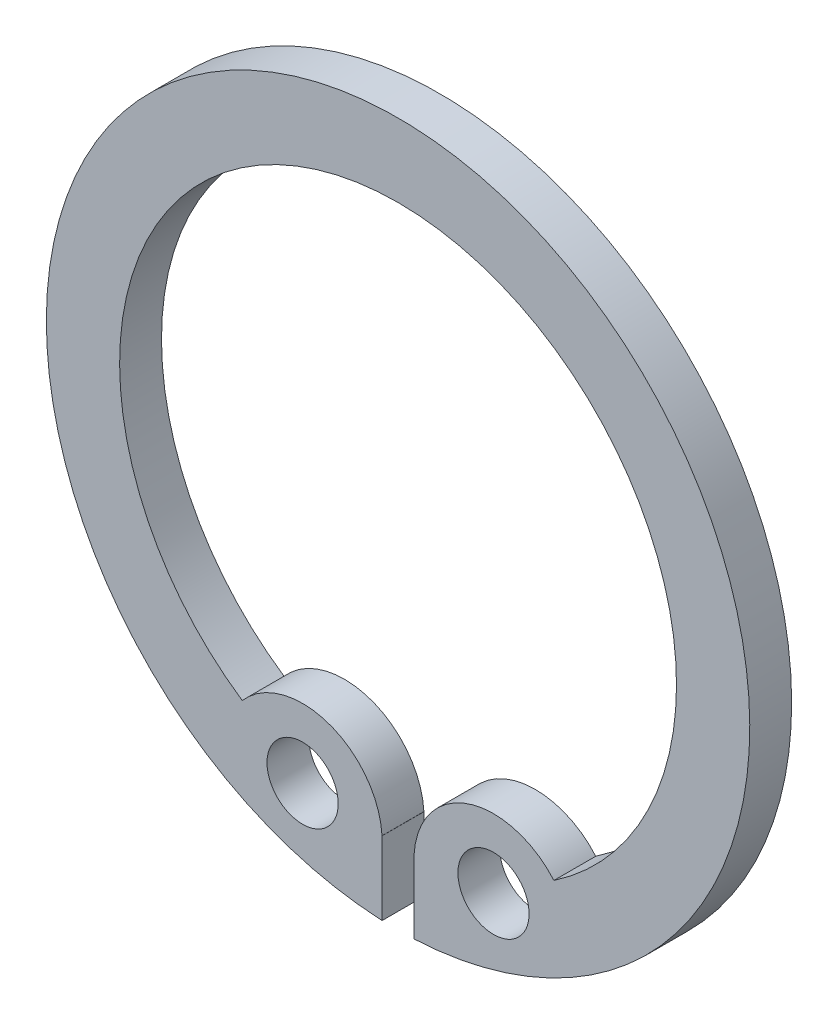
ISO-10303-21;
HEADER;
FILE_DESCRIPTION(('STEP AP214'),'2;1');
FILE_NAME('part.step','',(''),(''),'','','');
FILE_SCHEMA(('AUTOMOTIVE_DESIGN { 1 0 10303 214 1 1 1 1 }'));
ENDSEC;
DATA;
#1=APPLICATION_CONTEXT('core data for automotive mechanical design processes');
#2=APPLICATION_PROTOCOL_DEFINITION('international standard','automotive_design',2000,#1);
#3=PRODUCT_CONTEXT('',#1,'mechanical');
#4=PRODUCT('Part','Part','',(#3));
#5=PRODUCT_RELATED_PRODUCT_CATEGORY('part','',(#4));
#6=PRODUCT_DEFINITION_FORMATION('','',#4);
#7=PRODUCT_DEFINITION_CONTEXT('part definition',#1,'design');
#8=PRODUCT_DEFINITION('design','',#6,#7);
#9=PRODUCT_DEFINITION_SHAPE('','',#8);
#10=(LENGTH_UNIT() NAMED_UNIT(*) SI_UNIT(.MILLI.,.METRE.));
#11=(NAMED_UNIT(*) PLANE_ANGLE_UNIT() SI_UNIT($,.RADIAN.));
#12=(NAMED_UNIT(*) SI_UNIT($,.STERADIAN.) SOLID_ANGLE_UNIT());
#13=UNCERTAINTY_MEASURE_WITH_UNIT(LENGTH_MEASURE(1.E-05),#10,'distance_accuracy_value','');
#14=(GEOMETRIC_REPRESENTATION_CONTEXT(3) GLOBAL_UNCERTAINTY_ASSIGNED_CONTEXT((#13)) GLOBAL_UNIT_ASSIGNED_CONTEXT((#10,
#11,#12)) REPRESENTATION_CONTEXT('',''));
#15=CARTESIAN_POINT('',(0.,0.,0.));
#16=DIRECTION('',(0.,0.,1.));
#17=DIRECTION('',(1.,0.,0.));
#18=AXIS2_PLACEMENT_3D('',#15,#16,#17);
#19=CARTESIAN_POINT('',(0.,0.,1.));
#20=DIRECTION('',(0.,0.,1.));
#21=DIRECTION('',(1.,0.,0.));
#22=AXIS2_PLACEMENT_3D('',#19,#20,#21);
#23=PLANE('',#22);
#24=CARTESIAN_POINT('',(0.,0.,1.));
#25=DIRECTION('',(0.,0.,-1.));
#26=DIRECTION('',(1.,0.,0.));
#27=AXIS2_PLACEMENT_3D('',#24,#25,#26);
#28=CIRCLE('',#27,6.65);
#29=CARTESIAN_POINT('',(-3.7209215577053,-5.51155538495279,1.));
#30=VERTEX_POINT('',#29);
#31=CARTESIAN_POINT('',(3.7209215577057,-5.51155538495279,1.));
#32=VERTEX_POINT('',#31);
#33=EDGE_CURVE('E13',#30,#32,#28,.T.);
#34=ORIENTED_EDGE('',*,*,#33,.T.);
#35=CARTESIAN_POINT('',(2.28000000000017,-6.75,1.));
#36=DIRECTION('',(0.,0.,1.));
#37=DIRECTION('',(-1.,0.,0.));
#38=AXIS2_PLACEMENT_3D('',#35,#36,#37);
#39=CIRCLE('',#38,1.9);
#40=CARTESIAN_POINT('',(0.383248226518307,-6.63894726570943,1.));
#41=VERTEX_POINT('',#40);
#42=EDGE_CURVE('E139',#32,#41,#39,.T.);
#43=ORIENTED_EDGE('',*,*,#42,.T.);
#44=CARTESIAN_POINT('',(0.,0.,1.));
#45=DIRECTION('',(0.,0.,-1.));
#46=DIRECTION('',(1.,0.,0.));
#47=AXIS2_PLACEMENT_3D('',#44,#45,#46);
#48=CIRCLE('',#47,6.65);
#49=CARTESIAN_POINT('',(0.380000000000158,-6.63913397966934,1.));
#50=VERTEX_POINT('',#49);
#51=EDGE_CURVE('E117',#41,#50,#48,.T.);
#52=ORIENTED_EDGE('',*,*,#51,.T.);
#53=DIRECTION('',(0.,-1.,0.));
#54=VECTOR('',#53,1.);
#55=CARTESIAN_POINT('',(0.380000000000158,-4.07228349491734,1.));
#56=LINE('',#55,#54);
#57=CARTESIAN_POINT('',(0.379999999999991,-8.39140035989226,0.999999999999668));
#58=VERTEX_POINT('',#57);
#59=EDGE_CURVE('E112',#50,#58,#56,.T.);
#60=ORIENTED_EDGE('',*,*,#59,.T.);
#61=CARTESIAN_POINT('',(0.,0.,1.));
#62=DIRECTION('',(0.,0.,1.));
#63=DIRECTION('',(1.,0.,0.));
#64=AXIS2_PLACEMENT_3D('',#61,#62,#63);
#65=CIRCLE('',#64,8.4);
#66=CARTESIAN_POINT('',(-0.379999999999991,-8.39140035989226,0.999999999999668));
#67=VERTEX_POINT('',#66);
#68=EDGE_CURVE('E116',#58,#67,#65,.T.);
#69=ORIENTED_EDGE('',*,*,#68,.T.);
#70=DIRECTION('',(0.,1.,0.));
#71=VECTOR('',#70,1.);
#72=CARTESIAN_POINT('',(-0.379999999999853,-4.07228349491733,1.));
#73=LINE('',#72,#71);
#74=CARTESIAN_POINT('',(-0.379999999999825,-6.63913397966934,1.));
#75=VERTEX_POINT('',#74);
#76=EDGE_CURVE('E35',#67,#75,#73,.T.);
#77=ORIENTED_EDGE('',*,*,#76,.T.);
#78=CARTESIAN_POINT('',(0.,0.,1.));
#79=DIRECTION('',(0.,0.,-1.));
#80=DIRECTION('',(1.,0.,0.));
#81=AXIS2_PLACEMENT_3D('',#78,#79,#80);
#82=CIRCLE('',#81,6.65);
#83=CARTESIAN_POINT('',(-0.383248226517974,-6.63894726570943,1.));
#84=VERTEX_POINT('',#83);
#85=EDGE_CURVE('E149',#75,#84,#82,.T.);
#86=ORIENTED_EDGE('',*,*,#85,.T.);
#87=CARTESIAN_POINT('',(-2.27999999999984,-6.75,1.));
#88=DIRECTION('',(0.,0.,1.));
#89=DIRECTION('',(1.,0.,0.));
#90=AXIS2_PLACEMENT_3D('',#87,#88,#89);
#91=CIRCLE('',#90,1.9);
#92=EDGE_CURVE('E168',#84,#30,#91,.T.);
#93=ORIENTED_EDGE('',*,*,#92,.T.);
#94=EDGE_LOOP('',(#34,#43,#52,#60,#69,#77,#86,#93));
#95=FACE_BOUND('',#94,.T.);
#96=CARTESIAN_POINT('',(-2.27999999999984,-6.5,1.));
#97=DIRECTION('',(0.,0.,-1.));
#98=DIRECTION('',(1.,0.,0.));
#99=AXIS2_PLACEMENT_3D('',#96,#97,#98);
#100=CIRCLE('',#99,0.85);
#101=CARTESIAN_POINT('',(-3.12999999999983,-6.50000000000001,1.));
#102=VERTEX_POINT('',#101);
#103=EDGE_CURVE('E152',#102,#102,#100,.T.);
#104=ORIENTED_EDGE('',*,*,#103,.T.);
#105=EDGE_LOOP('',(#104));
#106=FACE_BOUND('',#105,.T.);
#107=CARTESIAN_POINT('',(2.28000000000017,-6.5,1.));
#108=DIRECTION('',(0.,0.,-1.));
#109=DIRECTION('',(1.,0.,0.));
#110=AXIS2_PLACEMENT_3D('',#107,#108,#109);
#111=CIRCLE('',#110,0.85);
#112=CARTESIAN_POINT('',(1.43000000000015,-6.5,1.));
#113=VERTEX_POINT('',#112);
#114=EDGE_CURVE('E148',#113,#113,#111,.T.);
#115=ORIENTED_EDGE('',*,*,#114,.T.);
#116=EDGE_LOOP('',(#115));
#117=FACE_BOUND('',#116,.T.);
#118=ADVANCED_FACE('F24',(#95,#106,#117),#23,.T.);
#119=CARTESIAN_POINT('',(1.66533453693773E-13,0.,-1.));
#120=DIRECTION('',(0.,0.,-1.));
#121=DIRECTION('',(1.,0.,0.));
#122=AXIS2_PLACEMENT_3D('',#119,#120,#121);
#123=CYLINDRICAL_SURFACE('',#122,6.65);
#124=DIRECTION('',(0.,0.,1.));
#125=VECTOR('',#124,1.);
#126=CARTESIAN_POINT('',(3.7209215577057,-5.51155538495279,0.5));
#127=LINE('',#126,#125);
#128=CARTESIAN_POINT('',(3.7209215577057,-5.5115553849528,0.));
#129=VERTEX_POINT('',#128);
#130=EDGE_CURVE('E28',#129,#32,#127,.T.);
#131=ORIENTED_EDGE('',*,*,#130,.T.);
#132=ORIENTED_EDGE('',*,*,#33,.F.);
#133=DIRECTION('',(0.,0.,-1.));
#134=VECTOR('',#133,1.);
#135=CARTESIAN_POINT('',(-3.72092155770537,-5.51155538495279,0.5));
#136=LINE('',#135,#134);
#137=CARTESIAN_POINT('',(-3.72092155770537,-5.51155538495279,0.));
#138=VERTEX_POINT('',#137);
#139=EDGE_CURVE('E165',#30,#138,#136,.T.);
#140=ORIENTED_EDGE('',*,*,#139,.T.);
#141=CARTESIAN_POINT('',(0.,0.,0.));
#142=DIRECTION('',(0.,0.,1.));
#143=DIRECTION('',(1.,0.,0.));
#144=AXIS2_PLACEMENT_3D('',#141,#142,#143);
#145=CIRCLE('',#144,6.65);
#146=EDGE_CURVE('E176',#129,#138,#145,.T.);
#147=ORIENTED_EDGE('',*,*,#146,.F.);
#148=EDGE_LOOP('',(#131,#132,#140,#147));
#149=FACE_BOUND('',#148,.T.);
#150=ADVANCED_FACE('F237',(#149),#123,.F.);
#151=CARTESIAN_POINT('',(-0.379999999999825,-8.14456698983467,-1.00000000000033));
#152=DIRECTION('',(-1.,0.,0.));
#153=DIRECTION('',(0.,-1.,0.));
#154=AXIS2_PLACEMENT_3D('',#151,#152,#153);
#155=PLANE('',#154);
#156=DIRECTION('',(0.,-1.,0.));
#157=VECTOR('',#156,1.);
#158=CARTESIAN_POINT('',(-0.379999999999991,-4.07228349491734,0.));
#159=LINE('',#158,#157);
#160=CARTESIAN_POINT('',(-0.379999999999825,-6.63913397966934,0.));
#161=VERTEX_POINT('',#160);
#162=CARTESIAN_POINT('',(-0.379999999999991,-8.39140035989226,-3.33066907387547E-13));
#163=VERTEX_POINT('',#162);
#164=EDGE_CURVE('E169',#161,#163,#159,.T.);
#165=ORIENTED_EDGE('',*,*,#164,.F.);
#166=DIRECTION('',(0.,0.,1.));
#167=VECTOR('',#166,1.);
#168=CARTESIAN_POINT('',(-0.379999999999686,-6.63913397966934,-1.));
#169=LINE('',#168,#167);
#170=EDGE_CURVE('E85',#161,#75,#169,.T.);
#171=ORIENTED_EDGE('',*,*,#170,.T.);
#172=ORIENTED_EDGE('',*,*,#76,.F.);
#173=DIRECTION('',(0.,0.,1.));
#174=VECTOR('',#173,1.);
#175=CARTESIAN_POINT('',(-0.379999999999991,-8.39140035989226,0.499999999999667));
#176=LINE('',#175,#174);
#177=EDGE_CURVE('E123',#163,#67,#176,.T.);
#178=ORIENTED_EDGE('',*,*,#177,.F.);
#179=EDGE_LOOP('',(#165,#171,#172,#178));
#180=FACE_BOUND('',#179,.T.);
#181=ADVANCED_FACE('F231',(#180),#155,.F.);
#182=CARTESIAN_POINT('',(1.66533453693773E-13,0.,-1.));
#183=DIRECTION('',(0.,0.,-1.));
#184=DIRECTION('',(1.,0.,0.));
#185=AXIS2_PLACEMENT_3D('',#182,#183,#184);
#186=CYLINDRICAL_SURFACE('',#185,6.65);
#187=DIRECTION('',(0.,0.,1.));
#188=VECTOR('',#187,1.);
#189=CARTESIAN_POINT('',(-0.383248226517974,-6.63894726570943,0.5));
#190=LINE('',#189,#188);
#191=CARTESIAN_POINT('',(-0.383248226517974,-6.63894726570943,0.));
#192=VERTEX_POINT('',#191);
#193=EDGE_CURVE('E79',#192,#84,#190,.T.);
#194=ORIENTED_EDGE('',*,*,#193,.T.);
#195=ORIENTED_EDGE('',*,*,#85,.F.);
#196=ORIENTED_EDGE('',*,*,#170,.F.);
#197=CARTESIAN_POINT('',(0.,0.,0.));
#198=DIRECTION('',(0.,0.,1.));
#199=DIRECTION('',(1.,0.,0.));
#200=AXIS2_PLACEMENT_3D('',#197,#198,#199);
#201=CIRCLE('',#200,6.65);
#202=EDGE_CURVE('E181',#192,#161,#201,.T.);
#203=ORIENTED_EDGE('',*,*,#202,.F.);
#204=EDGE_LOOP('',(#194,#195,#196,#203));
#205=FACE_BOUND('',#204,.T.);
#206=ADVANCED_FACE('F232',(#205),#186,.F.);
#207=CARTESIAN_POINT('',(-2.27999999999984,-6.75,0.5));
#208=DIRECTION('',(0.,0.,-1.));
#209=DIRECTION('',(1.,0.,0.));
#210=AXIS2_PLACEMENT_3D('',#207,#208,#209);
#211=CYLINDRICAL_SURFACE('',#210,1.9);
#212=ORIENTED_EDGE('',*,*,#139,.F.);
#213=ORIENTED_EDGE('',*,*,#92,.F.);
#214=ORIENTED_EDGE('',*,*,#193,.F.);
#215=CARTESIAN_POINT('',(-2.27999999999984,-6.75,0.));
#216=DIRECTION('',(0.,0.,-1.));
#217=DIRECTION('',(1.,0.,0.));
#218=AXIS2_PLACEMENT_3D('',#215,#216,#217);
#219=CIRCLE('',#218,1.9);
#220=EDGE_CURVE('E177',#138,#192,#219,.T.);
#221=ORIENTED_EDGE('',*,*,#220,.F.);
#222=EDGE_LOOP('',(#212,#213,#214,#221));
#223=FACE_BOUND('',#222,.T.);
#224=ADVANCED_FACE('F234',(#223),#211,.T.);
#225=CARTESIAN_POINT('',(0.,0.,0.));
#226=DIRECTION('',(0.,0.,-1.));
#227=DIRECTION('',(-1.,0.,0.));
#228=AXIS2_PLACEMENT_3D('',#225,#226,#227);
#229=PLANE('',#228);
#230=CARTESIAN_POINT('',(0.,0.,0.));
#231=DIRECTION('',(0.,0.,-1.));
#232=DIRECTION('',(1.,0.,0.));
#233=AXIS2_PLACEMENT_3D('',#230,#231,#232);
#234=CIRCLE('',#233,8.4);
#235=CARTESIAN_POINT('',(0.379999999999991,-8.39140035989227,-3.33066907387547E-13));
#236=VERTEX_POINT('',#235);
#237=EDGE_CURVE('E133',#163,#236,#234,.T.);
#238=ORIENTED_EDGE('',*,*,#237,.T.);
#239=DIRECTION('',(0.,1.,0.));
#240=VECTOR('',#239,1.);
#241=CARTESIAN_POINT('',(0.380000000000019,-4.07228349491735,0.));
#242=LINE('',#241,#240);
#243=CARTESIAN_POINT('',(0.380000000000158,-6.63913397966936,0.));
#244=VERTEX_POINT('',#243);
#245=EDGE_CURVE('E128',#236,#244,#242,.T.);
#246=ORIENTED_EDGE('',*,*,#245,.T.);
#247=CARTESIAN_POINT('',(0.,0.,0.));
#248=DIRECTION('',(0.,0.,1.));
#249=DIRECTION('',(1.,0.,0.));
#250=AXIS2_PLACEMENT_3D('',#247,#248,#249);
#251=CIRCLE('',#250,6.65);
#252=CARTESIAN_POINT('',(0.383248226518307,-6.63894726570945,0.));
#253=VERTEX_POINT('',#252);
#254=EDGE_CURVE('E102',#244,#253,#251,.T.);
#255=ORIENTED_EDGE('',*,*,#254,.T.);
#256=CARTESIAN_POINT('',(2.28000000000017,-6.75,0.));
#257=DIRECTION('',(0.,0.,-1.));
#258=DIRECTION('',(-1.,0.,0.));
#259=AXIS2_PLACEMENT_3D('',#256,#257,#258);
#260=CIRCLE('',#259,1.9);
#261=EDGE_CURVE('E157',#253,#129,#260,.T.);
#262=ORIENTED_EDGE('',*,*,#261,.T.);
#263=ORIENTED_EDGE('',*,*,#146,.T.);
#264=ORIENTED_EDGE('',*,*,#220,.T.);
#265=ORIENTED_EDGE('',*,*,#202,.T.);
#266=ORIENTED_EDGE('',*,*,#164,.T.);
#267=EDGE_LOOP('',(#238,#246,#255,#262,#263,#264,#265,#266));
#268=FACE_BOUND('',#267,.T.);
#269=CARTESIAN_POINT('',(-2.27999999999984,-6.5,0.));
#270=DIRECTION('',(0.,0.,1.));
#271=DIRECTION('',(1.,0.,0.));
#272=AXIS2_PLACEMENT_3D('',#269,#270,#271);
#273=CIRCLE('',#272,0.85);
#274=CARTESIAN_POINT('',(-3.12999999999983,-6.5,0.));
#275=VERTEX_POINT('',#274);
#276=EDGE_CURVE('E155',#275,#275,#273,.T.);
#277=ORIENTED_EDGE('',*,*,#276,.T.);
#278=EDGE_LOOP('',(#277));
#279=FACE_BOUND('',#278,.T.);
#280=CARTESIAN_POINT('',(2.28000000000017,-6.5,0.));
#281=DIRECTION('',(0.,0.,1.));
#282=DIRECTION('',(1.,0.,0.));
#283=AXIS2_PLACEMENT_3D('',#280,#281,#282);
#284=CIRCLE('',#283,0.85);
#285=CARTESIAN_POINT('',(1.43000000000015,-6.50000000000001,0.));
#286=VERTEX_POINT('',#285);
#287=EDGE_CURVE('E156',#286,#286,#284,.T.);
#288=ORIENTED_EDGE('',*,*,#287,.T.);
#289=EDGE_LOOP('',(#288));
#290=FACE_BOUND('',#289,.T.);
#291=ADVANCED_FACE('F228',(#268,#279,#290),#229,.T.);
#292=CARTESIAN_POINT('',(1.66533453693773E-13,0.,-1.));
#293=DIRECTION('',(0.,0.,-1.));
#294=DIRECTION('',(1.,0.,0.));
#295=AXIS2_PLACEMENT_3D('',#292,#293,#294);
#296=CYLINDRICAL_SURFACE('',#295,6.65);
#297=DIRECTION('',(0.,0.,-1.));
#298=VECTOR('',#297,1.);
#299=CARTESIAN_POINT('',(0.383248226518307,-6.63894726570944,0.5));
#300=LINE('',#299,#298);
#301=EDGE_CURVE('E144',#41,#253,#300,.T.);
#302=ORIENTED_EDGE('',*,*,#301,.T.);
#303=ORIENTED_EDGE('',*,*,#254,.F.);
#304=DIRECTION('',(0.,0.,1.));
#305=VECTOR('',#304,1.);
#306=CARTESIAN_POINT('',(0.380000000000325,-6.63913397966934,-1.));
#307=LINE('',#306,#305);
#308=EDGE_CURVE('E122',#244,#50,#307,.T.);
#309=ORIENTED_EDGE('',*,*,#308,.T.);
#310=ORIENTED_EDGE('',*,*,#51,.F.);
#311=EDGE_LOOP('',(#302,#303,#309,#310));
#312=FACE_BOUND('',#311,.T.);
#313=ADVANCED_FACE('F227',(#312),#296,.F.);
#314=CARTESIAN_POINT('',(0.380000000000158,-8.14456698983467,-1.00000000000033));
#315=DIRECTION('',(1.,0.,0.));
#316=DIRECTION('',(0.,1.,0.));
#317=AXIS2_PLACEMENT_3D('',#314,#315,#316);
#318=PLANE('',#317);
#319=ORIENTED_EDGE('',*,*,#59,.F.);
#320=ORIENTED_EDGE('',*,*,#308,.F.);
#321=ORIENTED_EDGE('',*,*,#245,.F.);
#322=DIRECTION('',(0.,0.,-1.));
#323=VECTOR('',#322,1.);
#324=CARTESIAN_POINT('',(0.379999999999991,-8.39140035989227,0.499999999999667));
#325=LINE('',#324,#323);
#326=EDGE_CURVE('E126',#58,#236,#325,.T.);
#327=ORIENTED_EDGE('',*,*,#326,.F.);
#328=EDGE_LOOP('',(#319,#320,#321,#327));
#329=FACE_BOUND('',#328,.T.);
#330=ADVANCED_FACE('F127',(#329),#318,.F.);
#331=CARTESIAN_POINT('',(0.,0.,0.5));
#332=DIRECTION('',(0.,0.,-1.));
#333=DIRECTION('',(1.,0.,0.));
#334=AXIS2_PLACEMENT_3D('',#331,#332,#333);
#335=CYLINDRICAL_SURFACE('',#334,8.4);
#336=ORIENTED_EDGE('',*,*,#68,.F.);
#337=ORIENTED_EDGE('',*,*,#326,.T.);
#338=ORIENTED_EDGE('',*,*,#237,.F.);
#339=ORIENTED_EDGE('',*,*,#177,.T.);
#340=EDGE_LOOP('',(#336,#337,#338,#339));
#341=FACE_BOUND('',#340,.T.);
#342=ADVANCED_FACE('F136',(#341),#335,.T.);
#343=CARTESIAN_POINT('',(2.28000000000017,-6.75,0.5));
#344=DIRECTION('',(0.,0.,1.));
#345=DIRECTION('',(-1.,0.,0.));
#346=AXIS2_PLACEMENT_3D('',#343,#344,#345);
#347=CYLINDRICAL_SURFACE('',#346,1.9);
#348=ORIENTED_EDGE('',*,*,#130,.F.);
#349=ORIENTED_EDGE('',*,*,#261,.F.);
#350=ORIENTED_EDGE('',*,*,#301,.F.);
#351=ORIENTED_EDGE('',*,*,#42,.F.);
#352=EDGE_LOOP('',(#348,#349,#350,#351));
#353=FACE_BOUND('',#352,.T.);
#354=ADVANCED_FACE('F260',(#353),#347,.T.);
#355=CARTESIAN_POINT('',(-2.27999999999984,-6.5,0.5));
#356=DIRECTION('',(0.,0.,-1.));
#357=DIRECTION('',(1.,0.,0.));
#358=AXIS2_PLACEMENT_3D('',#355,#356,#357);
#359=CYLINDRICAL_SURFACE('',#358,0.85);
#360=ORIENTED_EDGE('',*,*,#276,.F.);
#361=EDGE_LOOP('',(#360));
#362=FACE_BOUND('',#361,.T.);
#363=ORIENTED_EDGE('',*,*,#103,.F.);
#364=EDGE_LOOP('',(#363));
#365=FACE_BOUND('',#364,.T.);
#366=ADVANCED_FACE('F26',(#362,#365),#359,.F.);
#367=CARTESIAN_POINT('',(2.28000000000017,-6.5,0.5));
#368=DIRECTION('',(0.,0.,-1.));
#369=DIRECTION('',(1.,0.,0.));
#370=AXIS2_PLACEMENT_3D('',#367,#368,#369);
#371=CYLINDRICAL_SURFACE('',#370,0.85);
#372=ORIENTED_EDGE('',*,*,#287,.F.);
#373=EDGE_LOOP('',(#372));
#374=FACE_BOUND('',#373,.T.);
#375=ORIENTED_EDGE('',*,*,#114,.F.);
#376=EDGE_LOOP('',(#375));
#377=FACE_BOUND('',#376,.T.);
#378=ADVANCED_FACE('F252',(#374,#377),#371,.F.);
#379=CLOSED_SHELL('',(#118,#150,#181,#206,#224,#291,#313,#330,#342,#354,#366,#378));
#380=MANIFOLD_SOLID_BREP('B1',#379);
#381=ADVANCED_BREP_SHAPE_REPRESENTATION('',(#18,#380),#14);
#382=SHAPE_DEFINITION_REPRESENTATION(#9,#381);
ENDSEC;
END-ISO-10303-21;
